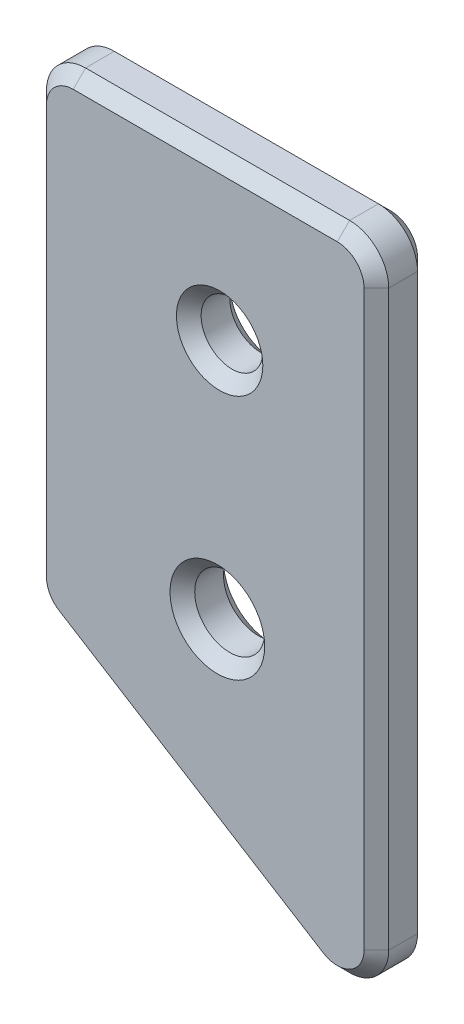
ISO-10303-21;
HEADER;
FILE_DESCRIPTION(('STEP AP214'),'2;1');
FILE_NAME('part.step','',(''),(''),'','','');
FILE_SCHEMA(('AUTOMOTIVE_DESIGN { 1 0 10303 214 1 1 1 1 }'));
ENDSEC;
DATA;
#1=APPLICATION_CONTEXT('core data for automotive mechanical design processes');
#2=APPLICATION_PROTOCOL_DEFINITION('international standard','automotive_design',2000,#1);
#3=PRODUCT_CONTEXT('',#1,'mechanical');
#4=PRODUCT('Part','Part','',(#3));
#5=PRODUCT_RELATED_PRODUCT_CATEGORY('part','',(#4));
#6=PRODUCT_DEFINITION_FORMATION('','',#4);
#7=PRODUCT_DEFINITION_CONTEXT('part definition',#1,'design');
#8=PRODUCT_DEFINITION('design','',#6,#7);
#9=PRODUCT_DEFINITION_SHAPE('','',#8);
#10=(LENGTH_UNIT() NAMED_UNIT(*) SI_UNIT(.MILLI.,.METRE.));
#11=(NAMED_UNIT(*) PLANE_ANGLE_UNIT() SI_UNIT($,.RADIAN.));
#12=(NAMED_UNIT(*) SI_UNIT($,.STERADIAN.) SOLID_ANGLE_UNIT());
#13=UNCERTAINTY_MEASURE_WITH_UNIT(LENGTH_MEASURE(1.E-05),#10,'distance_accuracy_value','');
#14=(GEOMETRIC_REPRESENTATION_CONTEXT(3) GLOBAL_UNCERTAINTY_ASSIGNED_CONTEXT((#13)) GLOBAL_UNIT_ASSIGNED_CONTEXT((#10,
#11,#12)) REPRESENTATION_CONTEXT('',''));
#15=CARTESIAN_POINT('',(0.,0.,0.));
#16=DIRECTION('',(0.,0.,1.));
#17=DIRECTION('',(1.,0.,0.));
#18=AXIS2_PLACEMENT_3D('',#15,#16,#17);
#19=CARTESIAN_POINT('',(-11.7460211072927,-18.8707720601408,6.5));
#20=DIRECTION('',(-0.528438334722349,-0.84897168762914,0.));
#21=DIRECTION('',(0.84897168762914,-0.528438334722349,0.));
#22=AXIS2_PLACEMENT_3D('',#19,#20,#21);
#23=PLANE('',#22);
#24=DIRECTION('',(0.,0.,-1.));
#25=VECTOR('',#24,1.);
#26=CARTESIAN_POINT('',(53.3810741385601,-59.4088185680665,6.5));
#27=LINE('',#26,#25);
#28=CARTESIAN_POINT('',(53.3810741385601,-59.4088185680665,4.99999999999999));
#29=VERTEX_POINT('',#28);
#30=CARTESIAN_POINT('',(53.3810741385601,-59.4088185680665,1.50000000000003));
#31=VERTEX_POINT('',#30);
#32=EDGE_CURVE('E310',#29,#31,#27,.T.);
#33=ORIENTED_EDGE('',*,*,#32,.F.);
#34=DIRECTION('',(-0.84897168762914,0.528438334722349,0.));
#35=VECTOR('',#34,1.);
#36=CARTESIAN_POINT('',(-11.7460211072927,-18.8707720601408,4.99999999999998));
#37=LINE('',#36,#35);
#38=CARTESIAN_POINT('',(21.2899179100688,-39.4338330605326,4.99999999999998));
#39=VERTEX_POINT('',#38);
#40=EDGE_CURVE('E218',#29,#39,#37,.T.);
#41=ORIENTED_EDGE('',*,*,#40,.T.);
#42=DIRECTION('',(0.,0.,-1.));
#43=VECTOR('',#42,1.);
#44=CARTESIAN_POINT('',(21.2899179100688,-39.4338330605326,0.));
#45=LINE('',#44,#43);
#46=CARTESIAN_POINT('',(21.2899179100688,-39.4338330605326,1.50000000000003));
#47=VERTEX_POINT('',#46);
#48=EDGE_CURVE('E306',#39,#47,#45,.T.);
#49=ORIENTED_EDGE('',*,*,#48,.T.);
#50=DIRECTION('',(0.84897168762914,-0.528438334722349,0.));
#51=VECTOR('',#50,1.);
#52=CARTESIAN_POINT('',(53.3810741385601,-59.4088185680665,1.50000000000003));
#53=LINE('',#52,#51);
#54=EDGE_CURVE('E216',#47,#31,#53,.T.);
#55=ORIENTED_EDGE('',*,*,#54,.T.);
#56=EDGE_LOOP('',(#33,#41,#49,#55));
#57=FACE_BOUND('',#56,.T.);
#58=ADVANCED_FACE('F37',(#57),#23,.T.);
#59=CARTESIAN_POINT('',(55.8911562284912,-55.3762030518281,6.5));
#60=DIRECTION('',(0.,0.,-1.));
#61=DIRECTION('',(-1.,0.,0.));
#62=AXIS2_PLACEMENT_3D('',#59,#60,#61);
#63=CYLINDRICAL_SURFACE('',#62,4.74999999999999);
#64=DIRECTION('',(0.,0.,-1.));
#65=VECTOR('',#64,1.);
#66=CARTESIAN_POINT('',(60.6411562284913,-55.3762030518281,6.5));
#67=LINE('',#66,#65);
#68=CARTESIAN_POINT('',(60.6411562284913,-55.3762030518281,4.99999999999999));
#69=VERTEX_POINT('',#68);
#70=CARTESIAN_POINT('',(60.6411562284913,-55.3762030518281,1.50000000000003));
#71=VERTEX_POINT('',#70);
#72=EDGE_CURVE('E344',#69,#71,#67,.T.);
#73=ORIENTED_EDGE('',*,*,#72,.F.);
#74=CARTESIAN_POINT('',(55.8911562284912,-55.3762030518281,4.99999999999998));
#75=DIRECTION('',(0.,0.,1.));
#76=DIRECTION('',(1.,0.,0.));
#77=AXIS2_PLACEMENT_3D('',#74,#75,#76);
#78=CIRCLE('',#77,4.74999999999999);
#79=EDGE_CURVE('E214',#69,#29,#78,.F.);
#80=ORIENTED_EDGE('',*,*,#79,.T.);
#81=ORIENTED_EDGE('',*,*,#32,.T.);
#82=CARTESIAN_POINT('',(55.8911562284912,-55.3762030518281,1.50000000000003));
#83=DIRECTION('',(0.,0.,1.));
#84=DIRECTION('',(1.,0.,0.));
#85=AXIS2_PLACEMENT_3D('',#82,#83,#84);
#86=CIRCLE('',#85,4.74999999999999);
#87=EDGE_CURVE('E211',#31,#71,#86,.T.);
#88=ORIENTED_EDGE('',*,*,#87,.T.);
#89=EDGE_LOOP('',(#73,#80,#81,#88));
#90=FACE_BOUND('',#89,.T.);
#91=ADVANCED_FACE('F353',(#90),#63,.T.);
#92=CARTESIAN_POINT('',(60.6411562284913,0.,6.5));
#93=DIRECTION('',(1.,0.,0.));
#94=DIRECTION('',(0.,0.,-1.));
#95=AXIS2_PLACEMENT_3D('',#92,#93,#94);
#96=PLANE('',#95);
#97=DIRECTION('',(0.,0.,-1.));
#98=VECTOR('',#97,1.);
#99=CARTESIAN_POINT('',(60.6411562284913,14.2999999999999,6.5));
#100=LINE('',#99,#98);
#101=CARTESIAN_POINT('',(60.6411562284913,14.2999999999999,4.99999999999999));
#102=VERTEX_POINT('',#101);
#103=CARTESIAN_POINT('',(60.6411562284913,14.2999999999999,1.50000000000003));
#104=VERTEX_POINT('',#103);
#105=EDGE_CURVE('E341',#102,#104,#100,.T.);
#106=ORIENTED_EDGE('',*,*,#105,.F.);
#107=DIRECTION('',(0.,-1.,0.));
#108=VECTOR('',#107,1.);
#109=CARTESIAN_POINT('',(60.6411562284913,0.,4.99999999999998));
#110=LINE('',#109,#108);
#111=EDGE_CURVE('E209',#102,#69,#110,.T.);
#112=ORIENTED_EDGE('',*,*,#111,.T.);
#113=ORIENTED_EDGE('',*,*,#72,.T.);
#114=DIRECTION('',(0.,1.,0.));
#115=VECTOR('',#114,1.);
#116=CARTESIAN_POINT('',(60.6411562284913,14.2999999999999,1.50000000000003));
#117=LINE('',#116,#115);
#118=EDGE_CURVE('E207',#71,#104,#117,.T.);
#119=ORIENTED_EDGE('',*,*,#118,.T.);
#120=EDGE_LOOP('',(#106,#112,#113,#119));
#121=FACE_BOUND('',#120,.T.);
#122=ADVANCED_FACE('F388',(#121),#96,.T.);
#123=CARTESIAN_POINT('',(55.8911562284913,14.2999999999999,6.5));
#124=DIRECTION('',(0.,0.,-1.));
#125=DIRECTION('',(-1.,0.,0.));
#126=AXIS2_PLACEMENT_3D('',#123,#124,#125);
#127=CYLINDRICAL_SURFACE('',#126,4.75);
#128=DIRECTION('',(0.,0.,-1.));
#129=VECTOR('',#128,1.);
#130=CARTESIAN_POINT('',(55.8911562284913,19.0499999999999,6.5));
#131=LINE('',#130,#129);
#132=CARTESIAN_POINT('',(55.8911562284913,19.0499999999999,4.99999999999999));
#133=VERTEX_POINT('',#132);
#134=CARTESIAN_POINT('',(55.8911562284913,19.0499999999999,1.50000000000003));
#135=VERTEX_POINT('',#134);
#136=EDGE_CURVE('E261',#133,#135,#131,.T.);
#137=ORIENTED_EDGE('',*,*,#136,.F.);
#138=CARTESIAN_POINT('',(55.8911562284913,14.2999999999999,4.99999999999998));
#139=DIRECTION('',(0.,0.,1.));
#140=DIRECTION('',(1.,0.,0.));
#141=AXIS2_PLACEMENT_3D('',#138,#139,#140);
#142=CIRCLE('',#141,4.75);
#143=EDGE_CURVE('E205',#133,#102,#142,.F.);
#144=ORIENTED_EDGE('',*,*,#143,.T.);
#145=ORIENTED_EDGE('',*,*,#105,.T.);
#146=CARTESIAN_POINT('',(55.8911562284913,14.2999999999999,1.50000000000003));
#147=DIRECTION('',(0.,0.,1.));
#148=DIRECTION('',(1.,0.,0.));
#149=AXIS2_PLACEMENT_3D('',#146,#147,#148);
#150=CIRCLE('',#149,4.75);
#151=EDGE_CURVE('E203',#104,#135,#150,.T.);
#152=ORIENTED_EDGE('',*,*,#151,.T.);
#153=EDGE_LOOP('',(#137,#144,#145,#152));
#154=FACE_BOUND('',#153,.T.);
#155=ADVANCED_FACE('F617',(#154),#127,.T.);
#156=CARTESIAN_POINT('',(0.,19.0499999999999,6.5));
#157=DIRECTION('',(0.,-1.,0.));
#158=DIRECTION('',(1.,0.,0.));
#159=AXIS2_PLACEMENT_3D('',#156,#157,#158);
#160=PLANE('',#159);
#161=DIRECTION('',(0.,0.,-1.));
#162=VECTOR('',#161,1.);
#163=CARTESIAN_POINT('',(23.8,19.0499999999999,6.5));
#164=LINE('',#163,#162);
#165=CARTESIAN_POINT('',(23.8,19.0499999999999,1.50000000000003));
#166=VERTEX_POINT('',#165);
#167=CARTESIAN_POINT('',(23.8,19.0499999999999,4.99999999999998));
#168=VERTEX_POINT('',#167);
#169=EDGE_CURVE('E300',#166,#168,#164,.F.);
#170=ORIENTED_EDGE('',*,*,#169,.T.);
#171=DIRECTION('',(1.,0.,0.));
#172=VECTOR('',#171,1.);
#173=CARTESIAN_POINT('',(55.8911562284913,19.0499999999999,4.99999999999998));
#174=LINE('',#173,#172);
#175=EDGE_CURVE('E201',#168,#133,#174,.T.);
#176=ORIENTED_EDGE('',*,*,#175,.T.);
#177=ORIENTED_EDGE('',*,*,#136,.T.);
#178=DIRECTION('',(-1.,0.,0.));
#179=VECTOR('',#178,1.);
#180=CARTESIAN_POINT('',(0.,19.0499999999999,1.50000000000003));
#181=LINE('',#180,#179);
#182=EDGE_CURVE('E199',#135,#166,#181,.T.);
#183=ORIENTED_EDGE('',*,*,#182,.T.);
#184=EDGE_LOOP('',(#170,#176,#177,#183));
#185=FACE_BOUND('',#184,.T.);
#186=ADVANCED_FACE('F339',(#185),#160,.F.);
#187=CARTESIAN_POINT('',(41.5911562284913,-2.84494650060196E-13,6.5));
#188=DIRECTION('',(0.,0.,-1.));
#189=DIRECTION('',(-1.,0.,0.));
#190=AXIS2_PLACEMENT_3D('',#187,#188,#189);
#191=CYLINDRICAL_SURFACE('',#190,3.74999999999999);
#192=CARTESIAN_POINT('',(41.5911562284913,-2.84494650060196E-13,4.99999999999995));
#193=DIRECTION('',(0.,0.,1.));
#194=DIRECTION('',(1.,0.,0.));
#195=AXIS2_PLACEMENT_3D('',#192,#193,#194);
#196=CIRCLE('',#195,3.74999999999999);
#197=CARTESIAN_POINT('',(37.8411562284913,-2.84494650060196E-13,4.99999999999995));
#198=VERTEX_POINT('',#197);
#199=EDGE_CURVE('E193',#198,#198,#196,.T.);
#200=CARTESIAN_POINT('',(41.5911562284913,-2.84494650060196E-13,1.49999999999997));
#201=DIRECTION('',(0.,0.,1.));
#202=DIRECTION('',(1.,0.,0.));
#203=AXIS2_PLACEMENT_3D('',#200,#201,#202);
#204=CIRCLE('',#203,3.74999999999999);
#205=CARTESIAN_POINT('',(37.8411562284913,-2.84494650060196E-13,1.49999999999997));
#206=VERTEX_POINT('',#205);
#207=EDGE_CURVE('E190',#206,#206,#204,.F.);
#208=CARTESIAN_POINT('',(37.8411562284913,-2.84494650060196E-13,4.99999999999995));
#209=CARTESIAN_POINT('',(37.8411562284913,-2.84494650060196E-13,4.96354166666662));
#210=CARTESIAN_POINT('',(37.8411562284913,-2.84494650060196E-13,4.92708333333328));
#211=CARTESIAN_POINT('',(37.8411562284913,-2.84494650060196E-13,4.85416666666662));
#212=CARTESIAN_POINT('',(37.8411562284913,-2.84494650060196E-13,4.81770833333328));
#213=CARTESIAN_POINT('',(37.8411562284913,-2.84494650060196E-13,4.74479166666662));
#214=CARTESIAN_POINT('',(37.8411562284913,-2.84494650060196E-13,4.70833333333328));
#215=CARTESIAN_POINT('',(37.8411562284913,-2.84494650060196E-13,4.63541666666662));
#216=CARTESIAN_POINT('',(37.8411562284913,-2.84494650060196E-13,4.59895833333328));
#217=CARTESIAN_POINT('',(37.8411562284913,-2.84494650060196E-13,4.52604166666662));
#218=CARTESIAN_POINT('',(37.8411562284913,-2.84494650060196E-13,4.48958333333328));
#219=CARTESIAN_POINT('',(37.8411562284913,-2.84494650060196E-13,4.41666666666662));
#220=CARTESIAN_POINT('',(37.8411562284913,-2.84494650060196E-13,4.38020833333328));
#221=CARTESIAN_POINT('',(37.8411562284913,-2.84494650060196E-13,4.30729166666662));
#222=CARTESIAN_POINT('',(37.8411562284913,-2.84494650060196E-13,4.27083333333329));
#223=CARTESIAN_POINT('',(37.8411562284913,-2.84494650060196E-13,4.19791666666662));
#224=CARTESIAN_POINT('',(37.8411562284913,-2.84494650060196E-13,4.16145833333329));
#225=CARTESIAN_POINT('',(37.8411562284913,-2.84494650060196E-13,4.08854166666662));
#226=CARTESIAN_POINT('',(37.8411562284913,-2.84494650060196E-13,4.05208333333329));
#227=CARTESIAN_POINT('',(37.8411562284913,-2.84494650060196E-13,3.97916666666662));
#228=CARTESIAN_POINT('',(37.8411562284913,-2.84494650060196E-13,3.94270833333329));
#229=CARTESIAN_POINT('',(37.8411562284913,-2.84494650060196E-13,3.86979166666662));
#230=CARTESIAN_POINT('',(37.8411562284913,-2.84494650060196E-13,3.83333333333329));
#231=CARTESIAN_POINT('',(37.8411562284913,-2.84494650060196E-13,3.76041666666662));
#232=CARTESIAN_POINT('',(37.8411562284913,-2.84494650060196E-13,3.72395833333329));
#233=CARTESIAN_POINT('',(37.8411562284913,-2.84494650060196E-13,3.65104166666662));
#234=CARTESIAN_POINT('',(37.8411562284913,-2.84494650060196E-13,3.61458333333329));
#235=CARTESIAN_POINT('',(37.8411562284913,-2.84494650060196E-13,3.54166666666662));
#236=CARTESIAN_POINT('',(37.8411562284913,-2.84494650060196E-13,3.50520833333329));
#237=CARTESIAN_POINT('',(37.8411562284913,-2.84494650060196E-13,3.43229166666662));
#238=CARTESIAN_POINT('',(37.8411562284913,-2.84494650060196E-13,3.39583333333329));
#239=CARTESIAN_POINT('',(37.8411562284913,-2.84494650060196E-13,3.32291666666662));
#240=CARTESIAN_POINT('',(37.8411562284913,-2.84494650060196E-13,3.28645833333329));
#241=CARTESIAN_POINT('',(37.8411562284913,-2.84494650060196E-13,3.21354166666663));
#242=CARTESIAN_POINT('',(37.8411562284913,-2.84494650060196E-13,3.17708333333329));
#243=CARTESIAN_POINT('',(37.8411562284913,-2.84494650060196E-13,3.10416666666663));
#244=CARTESIAN_POINT('',(37.8411562284913,-2.84494650060196E-13,3.06770833333329));
#245=CARTESIAN_POINT('',(37.8411562284913,-2.84494650060196E-13,2.99479166666663));
#246=CARTESIAN_POINT('',(37.8411562284913,-2.84494650060196E-13,2.95833333333329));
#247=CARTESIAN_POINT('',(37.8411562284913,-2.84494650060196E-13,2.88541666666663));
#248=CARTESIAN_POINT('',(37.8411562284913,-2.84494650060196E-13,2.84895833333329));
#249=CARTESIAN_POINT('',(37.8411562284913,-2.84494650060196E-13,2.77604166666663));
#250=CARTESIAN_POINT('',(37.8411562284913,-2.84494650060196E-13,2.73958333333329));
#251=CARTESIAN_POINT('',(37.8411562284913,-2.84494650060196E-13,2.66666666666663));
#252=CARTESIAN_POINT('',(37.8411562284913,-2.84494650060196E-13,2.6302083333333));
#253=CARTESIAN_POINT('',(37.8411562284913,-2.84494650060196E-13,2.55729166666663));
#254=CARTESIAN_POINT('',(37.8411562284913,-2.84494650060196E-13,2.5208333333333));
#255=CARTESIAN_POINT('',(37.8411562284913,-2.84494650060196E-13,2.44791666666663));
#256=CARTESIAN_POINT('',(37.8411562284913,-2.84494650060196E-13,2.4114583333333));
#257=CARTESIAN_POINT('',(37.8411562284913,-2.84494650060196E-13,2.33854166666663));
#258=CARTESIAN_POINT('',(37.8411562284913,-2.84494650060196E-13,2.3020833333333));
#259=CARTESIAN_POINT('',(37.8411562284913,-2.84494650060196E-13,2.22916666666663));
#260=CARTESIAN_POINT('',(37.8411562284913,-2.84494650060196E-13,2.1927083333333));
#261=CARTESIAN_POINT('',(37.8411562284913,-2.84494650060196E-13,2.11979166666663));
#262=CARTESIAN_POINT('',(37.8411562284913,-2.84494650060196E-13,2.0833333333333));
#263=CARTESIAN_POINT('',(37.8411562284913,-2.84494650060196E-13,2.01041666666663));
#264=CARTESIAN_POINT('',(37.8411562284913,-2.84494650060196E-13,1.9739583333333));
#265=CARTESIAN_POINT('',(37.8411562284913,-2.84494650060196E-13,1.90104166666663));
#266=CARTESIAN_POINT('',(37.8411562284913,-2.84494650060196E-13,1.8645833333333));
#267=CARTESIAN_POINT('',(37.8411562284913,-2.84494650060196E-13,1.79166666666663));
#268=CARTESIAN_POINT('',(37.8411562284913,-2.84494650060196E-13,1.7552083333333));
#269=CARTESIAN_POINT('',(37.8411562284913,-2.84494650060196E-13,1.68229166666663));
#270=CARTESIAN_POINT('',(37.8411562284913,-2.84494650060196E-13,1.6458333333333));
#271=CARTESIAN_POINT('',(37.8411562284913,-2.84494650060196E-13,1.57291666666663));
#272=CARTESIAN_POINT('',(37.8411562284913,-2.84494650060196E-13,1.5364583333333));
#273=CARTESIAN_POINT('',(37.8411562284913,-2.84494650060196E-13,1.49999999999997));
#274=B_SPLINE_CURVE_WITH_KNOTS('',3,(#208,#209,#210,#211,#212,#213,#214,#215,#216,#217,#218,
#219,#220,#221,#222,#223,#224,#225,#226,#227,#228,#229,#230,#231,#232,#233,#234,#235,#236,#237,
#238,#239,#240,#241,#242,#243,#244,#245,#246,#247,#248,#249,#250,#251,#252,#253,#254,#255,#256,
#257,#258,#259,#260,#261,#262,#263,#264,#265,#266,#267,#268,#269,#270,#271,#272,#273),
.UNSPECIFIED.,.F.,.F.,(4,2,2,2,2,2,2,2,2,2,2,2,2,2,2,2,2,2,2,2,2,2,2,2,2,2,2,2,2,2,2,2,4),(0.,
0.109374999999999,0.218749999999999,0.328124999999999,0.437499999999998,0.546874999999997,
0.656249999999996,0.765624999999996,0.874999999999995,0.984374999999995,1.09374999999999,
1.20312499999999,1.31249999999999,1.42187499999999,1.53124999999999,1.64062499999999,
1.74999999999999,1.85937499999999,1.96874999999999,2.07812499999999,2.18749999999999,
2.29687499999999,2.40624999999999,2.51562499999999,2.62499999999998,2.73437499999998,
2.84374999999998,2.95312499999998,3.06249999999998,3.17187499999998,3.28124999999998,
3.39062499999998,3.49999999999998),.UNSPECIFIED.);
#275=EDGE_CURVE('BSEAM599',#198,#206,#274,.T.);
#276=ORIENTED_EDGE('',*,*,#199,.T.);
#277=ORIENTED_EDGE('',*,*,#207,.T.);
#278=ORIENTED_EDGE('',*,*,#275,.T.);
#279=ORIENTED_EDGE('',*,*,#275,.F.);
#280=EDGE_LOOP('',(#276,#278,#277,#279));
#281=FACE_BOUND('',#280,.T.);
#282=ADVANCED_FACE('F599',(#281),#191,.F.);
#283=CARTESIAN_POINT('',(41.3149906063359,-29.459432199959,6.5));
#284=DIRECTION('',(0.,0.,-1.));
#285=DIRECTION('',(-1.,0.,0.));
#286=AXIS2_PLACEMENT_3D('',#283,#284,#285);
#287=CYLINDRICAL_SURFACE('',#286,4.25);
#288=CARTESIAN_POINT('',(41.3149906063359,-29.459432199959,4.99999999999995));
#289=DIRECTION('',(0.,0.,1.));
#290=DIRECTION('',(1.,0.,0.));
#291=AXIS2_PLACEMENT_3D('',#288,#289,#290);
#292=CIRCLE('',#291,4.25);
#293=CARTESIAN_POINT('',(37.0649906063359,-29.459432199959,4.99999999999995));
#294=VERTEX_POINT('',#293);
#295=EDGE_CURVE('E173',#294,#294,#292,.T.);
#296=CARTESIAN_POINT('',(41.3149906063359,-29.459432199959,1.49999999999997));
#297=DIRECTION('',(0.,0.,1.));
#298=DIRECTION('',(1.,0.,0.));
#299=AXIS2_PLACEMENT_3D('',#296,#297,#298);
#300=CIRCLE('',#299,4.25);
#301=CARTESIAN_POINT('',(37.0649906063359,-29.459432199959,1.49999999999997));
#302=VERTEX_POINT('',#301);
#303=EDGE_CURVE('E315',#302,#302,#300,.F.);
#304=CARTESIAN_POINT('',(37.0649906063359,-29.459432199959,4.99999999999995));
#305=CARTESIAN_POINT('',(37.0649906063359,-29.459432199959,4.96354166666662));
#306=CARTESIAN_POINT('',(37.0649906063359,-29.459432199959,4.92708333333329));
#307=CARTESIAN_POINT('',(37.0649906063359,-29.459432199959,4.85416666666662));
#308=CARTESIAN_POINT('',(37.0649906063359,-29.459432199959,4.81770833333329));
#309=CARTESIAN_POINT('',(37.0649906063359,-29.459432199959,4.74479166666662));
#310=CARTESIAN_POINT('',(37.0649906063359,-29.459432199959,4.70833333333329));
#311=CARTESIAN_POINT('',(37.0649906063359,-29.459432199959,4.63541666666662));
#312=CARTESIAN_POINT('',(37.0649906063359,-29.459432199959,4.59895833333329));
#313=CARTESIAN_POINT('',(37.0649906063359,-29.459432199959,4.52604166666662));
#314=CARTESIAN_POINT('',(37.0649906063359,-29.459432199959,4.48958333333329));
#315=CARTESIAN_POINT('',(37.0649906063359,-29.459432199959,4.41666666666662));
#316=CARTESIAN_POINT('',(37.0649906063359,-29.459432199959,4.38020833333329));
#317=CARTESIAN_POINT('',(37.0649906063359,-29.459432199959,4.30729166666662));
#318=CARTESIAN_POINT('',(37.0649906063359,-29.459432199959,4.27083333333329));
#319=CARTESIAN_POINT('',(37.0649906063359,-29.459432199959,4.19791666666662));
#320=CARTESIAN_POINT('',(37.0649906063359,-29.459432199959,4.16145833333329));
#321=CARTESIAN_POINT('',(37.0649906063359,-29.459432199959,4.08854166666662));
#322=CARTESIAN_POINT('',(37.0649906063359,-29.459432199959,4.05208333333329));
#323=CARTESIAN_POINT('',(37.0649906063359,-29.459432199959,3.97916666666662));
#324=CARTESIAN_POINT('',(37.0649906063359,-29.459432199959,3.94270833333329));
#325=CARTESIAN_POINT('',(37.0649906063359,-29.459432199959,3.86979166666662));
#326=CARTESIAN_POINT('',(37.0649906063359,-29.459432199959,3.83333333333329));
#327=CARTESIAN_POINT('',(37.0649906063359,-29.459432199959,3.76041666666662));
#328=CARTESIAN_POINT('',(37.0649906063359,-29.459432199959,3.72395833333329));
#329=CARTESIAN_POINT('',(37.0649906063359,-29.459432199959,3.65104166666662));
#330=CARTESIAN_POINT('',(37.0649906063359,-29.459432199959,3.61458333333329));
#331=CARTESIAN_POINT('',(37.0649906063359,-29.459432199959,3.54166666666663));
#332=CARTESIAN_POINT('',(37.0649906063359,-29.459432199959,3.50520833333329));
#333=CARTESIAN_POINT('',(37.0649906063359,-29.459432199959,3.43229166666663));
#334=CARTESIAN_POINT('',(37.0649906063359,-29.459432199959,3.39583333333329));
#335=CARTESIAN_POINT('',(37.0649906063359,-29.459432199959,3.32291666666663));
#336=CARTESIAN_POINT('',(37.0649906063359,-29.459432199959,3.28645833333329));
#337=CARTESIAN_POINT('',(37.0649906063359,-29.459432199959,3.21354166666663));
#338=CARTESIAN_POINT('',(37.0649906063359,-29.459432199959,3.17708333333329));
#339=CARTESIAN_POINT('',(37.0649906063359,-29.459432199959,3.10416666666663));
#340=CARTESIAN_POINT('',(37.0649906063359,-29.459432199959,3.06770833333329));
#341=CARTESIAN_POINT('',(37.0649906063359,-29.459432199959,2.99479166666663));
#342=CARTESIAN_POINT('',(37.0649906063359,-29.459432199959,2.95833333333329));
#343=CARTESIAN_POINT('',(37.0649906063359,-29.459432199959,2.88541666666663));
#344=CARTESIAN_POINT('',(37.0649906063359,-29.459432199959,2.84895833333329));
#345=CARTESIAN_POINT('',(37.0649906063359,-29.459432199959,2.77604166666663));
#346=CARTESIAN_POINT('',(37.0649906063359,-29.459432199959,2.7395833333333));
#347=CARTESIAN_POINT('',(37.0649906063359,-29.459432199959,2.66666666666663));
#348=CARTESIAN_POINT('',(37.0649906063359,-29.459432199959,2.6302083333333));
#349=CARTESIAN_POINT('',(37.0649906063359,-29.459432199959,2.55729166666663));
#350=CARTESIAN_POINT('',(37.0649906063359,-29.459432199959,2.5208333333333));
#351=CARTESIAN_POINT('',(37.0649906063359,-29.459432199959,2.44791666666663));
#352=CARTESIAN_POINT('',(37.0649906063359,-29.459432199959,2.4114583333333));
#353=CARTESIAN_POINT('',(37.0649906063359,-29.459432199959,2.33854166666663));
#354=CARTESIAN_POINT('',(37.0649906063359,-29.459432199959,2.3020833333333));
#355=CARTESIAN_POINT('',(37.0649906063359,-29.459432199959,2.22916666666663));
#356=CARTESIAN_POINT('',(37.0649906063359,-29.459432199959,2.1927083333333));
#357=CARTESIAN_POINT('',(37.0649906063359,-29.459432199959,2.11979166666663));
#358=CARTESIAN_POINT('',(37.0649906063359,-29.459432199959,2.0833333333333));
#359=CARTESIAN_POINT('',(37.0649906063359,-29.459432199959,2.01041666666663));
#360=CARTESIAN_POINT('',(37.0649906063359,-29.459432199959,1.9739583333333));
#361=CARTESIAN_POINT('',(37.0649906063359,-29.459432199959,1.90104166666663));
#362=CARTESIAN_POINT('',(37.0649906063359,-29.459432199959,1.8645833333333));
#363=CARTESIAN_POINT('',(37.0649906063359,-29.459432199959,1.79166666666663));
#364=CARTESIAN_POINT('',(37.0649906063359,-29.459432199959,1.7552083333333));
#365=CARTESIAN_POINT('',(37.0649906063359,-29.459432199959,1.68229166666663));
#366=CARTESIAN_POINT('',(37.0649906063359,-29.459432199959,1.6458333333333));
#367=CARTESIAN_POINT('',(37.0649906063359,-29.459432199959,1.57291666666663));
#368=CARTESIAN_POINT('',(37.0649906063359,-29.459432199959,1.5364583333333));
#369=CARTESIAN_POINT('',(37.0649906063359,-29.459432199959,1.49999999999997));
#370=B_SPLINE_CURVE_WITH_KNOTS('',3,(#304,#305,#306,#307,#308,#309,#310,#311,#312,#313,#314,
#315,#316,#317,#318,#319,#320,#321,#322,#323,#324,#325,#326,#327,#328,#329,#330,#331,#332,#333,
#334,#335,#336,#337,#338,#339,#340,#341,#342,#343,#344,#345,#346,#347,#348,#349,#350,#351,#352,
#353,#354,#355,#356,#357,#358,#359,#360,#361,#362,#363,#364,#365,#366,#367,#368,#369),
.UNSPECIFIED.,.F.,.F.,(4,2,2,2,2,2,2,2,2,2,2,2,2,2,2,2,2,2,2,2,2,2,2,2,2,2,2,2,2,2,2,2,4),(0.,
0.109374999999999,0.218749999999999,0.328124999999999,0.437499999999998,0.546874999999998,
0.656249999999996,0.765624999999996,0.874999999999996,0.984374999999995,1.09374999999999,
1.20312499999999,1.31249999999999,1.42187499999999,1.53124999999999,1.64062499999999,
1.74999999999999,1.85937499999999,1.96874999999999,2.07812499999999,2.18749999999999,
2.29687499999999,2.40624999999999,2.51562499999999,2.62499999999999,2.73437499999999,
2.84374999999999,2.95312499999999,3.06249999999999,3.17187499999998,3.28124999999998,
3.39062499999998,3.49999999999998),.UNSPECIFIED.);
#371=EDGE_CURVE('BSEAM378',#294,#302,#370,.T.);
#372=ORIENTED_EDGE('',*,*,#295,.T.);
#373=ORIENTED_EDGE('',*,*,#303,.T.);
#374=ORIENTED_EDGE('',*,*,#371,.T.);
#375=ORIENTED_EDGE('',*,*,#371,.F.);
#376=EDGE_LOOP('',(#372,#374,#373,#375));
#377=FACE_BOUND('',#376,.T.);
#378=ADVANCED_FACE('F378',(#377),#287,.F.);
#379=CARTESIAN_POINT('',(0.,0.,6.5));
#380=DIRECTION('',(0.,0.,1.));
#381=DIRECTION('',(1.,0.,0.));
#382=AXIS2_PLACEMENT_3D('',#379,#380,#381);
#383=PLANE('',#382);
#384=CARTESIAN_POINT('',(41.3149906063359,-29.459432199959,6.5));
#385=DIRECTION('',(0.,0.,1.));
#386=DIRECTION('',(1.,0.,0.));
#387=AXIS2_PLACEMENT_3D('',#384,#385,#386);
#388=CIRCLE('',#387,5.75000000000005);
#389=CARTESIAN_POINT('',(47.0649906063359,-29.459432199959,6.5));
#390=VERTEX_POINT('',#389);
#391=EDGE_CURVE('E182',#390,#390,#388,.F.);
#392=ORIENTED_EDGE('',*,*,#391,.T.);
#393=EDGE_LOOP('',(#392));
#394=FACE_BOUND('',#393,.T.);
#395=CARTESIAN_POINT('',(41.5911562284913,-2.84494650060196E-13,6.5));
#396=DIRECTION('',(0.,0.,1.));
#397=DIRECTION('',(1.,0.,0.));
#398=AXIS2_PLACEMENT_3D('',#395,#396,#397);
#399=CIRCLE('',#398,5.25000000000005);
#400=CARTESIAN_POINT('',(46.8411562284913,-2.84494650060196E-13,6.5));
#401=VERTEX_POINT('',#400);
#402=EDGE_CURVE('E179',#401,#401,#399,.F.);
#403=ORIENTED_EDGE('',*,*,#402,.T.);
#404=EDGE_LOOP('',(#403));
#405=FACE_BOUND('',#404,.T.);
#406=DIRECTION('',(-1.,0.,0.));
#407=VECTOR('',#406,1.);
#408=CARTESIAN_POINT('',(23.8,17.5499999999999,6.5));
#409=LINE('',#408,#407);
#410=CARTESIAN_POINT('',(55.8911562284913,17.5499999999999,6.5));
#411=VERTEX_POINT('',#410);
#412=CARTESIAN_POINT('',(23.8,17.5499999999999,6.5));
#413=VERTEX_POINT('',#412);
#414=EDGE_CURVE('E177',#411,#413,#409,.T.);
#415=ORIENTED_EDGE('',*,*,#414,.T.);
#416=CARTESIAN_POINT('',(23.8,14.2999999999999,6.5));
#417=DIRECTION('',(0.,0.,1.));
#418=DIRECTION('',(1.,0.,0.));
#419=AXIS2_PLACEMENT_3D('',#416,#417,#418);
#420=CIRCLE('',#419,3.24999999999999);
#421=CARTESIAN_POINT('',(20.55,14.2999999999999,6.5));
#422=VERTEX_POINT('',#421);
#423=EDGE_CURVE('E158',#413,#422,#420,.T.);
#424=ORIENTED_EDGE('',*,*,#423,.T.);
#425=DIRECTION('',(0.,-1.,0.));
#426=VECTOR('',#425,1.);
#427=CARTESIAN_POINT('',(20.55,-35.4012175442942,6.5));
#428=LINE('',#427,#426);
#429=CARTESIAN_POINT('',(20.55,-35.4012175442942,6.5));
#430=VERTEX_POINT('',#429);
#431=EDGE_CURVE('E166',#422,#430,#428,.T.);
#432=ORIENTED_EDGE('',*,*,#431,.T.);
#433=CARTESIAN_POINT('',(23.8,-35.4012175442942,6.5));
#434=DIRECTION('',(0.,0.,1.));
#435=DIRECTION('',(1.,0.,0.));
#436=AXIS2_PLACEMENT_3D('',#433,#434,#435);
#437=CIRCLE('',#436,3.24999999999998);
#438=CARTESIAN_POINT('',(22.0825754121524,-38.1603755290889,6.5));
#439=VERTEX_POINT('',#438);
#440=EDGE_CURVE('E172',#430,#439,#437,.T.);
#441=ORIENTED_EDGE('',*,*,#440,.T.);
#442=DIRECTION('',(0.84897168762914,-0.528438334722349,0.));
#443=VECTOR('',#442,1.);
#444=CARTESIAN_POINT('',(-10.9533636052092,-17.597314528697,6.5));
#445=LINE('',#444,#443);
#446=CARTESIAN_POINT('',(54.1737316406437,-58.1353610366228,6.5));
#447=VERTEX_POINT('',#446);
#448=EDGE_CURVE('E321',#439,#447,#445,.T.);
#449=ORIENTED_EDGE('',*,*,#448,.T.);
#450=CARTESIAN_POINT('',(55.8911562284912,-55.3762030518281,6.5));
#451=DIRECTION('',(0.,0.,1.));
#452=DIRECTION('',(1.,0.,0.));
#453=AXIS2_PLACEMENT_3D('',#450,#451,#452);
#454=CIRCLE('',#453,3.24999999999997);
#455=CARTESIAN_POINT('',(59.1411562284912,-55.3762030518281,6.5));
#456=VERTEX_POINT('',#455);
#457=EDGE_CURVE('E323',#447,#456,#454,.T.);
#458=ORIENTED_EDGE('',*,*,#457,.T.);
#459=DIRECTION('',(0.,1.,0.));
#460=VECTOR('',#459,1.);
#461=CARTESIAN_POINT('',(59.1411562284913,0.,6.5));
#462=LINE('',#461,#460);
#463=CARTESIAN_POINT('',(59.1411562284913,14.2999999999999,6.5));
#464=VERTEX_POINT('',#463);
#465=EDGE_CURVE('E325',#456,#464,#462,.T.);
#466=ORIENTED_EDGE('',*,*,#465,.T.);
#467=CARTESIAN_POINT('',(55.8911562284913,14.2999999999999,6.5));
#468=DIRECTION('',(0.,0.,1.));
#469=DIRECTION('',(1.,0.,0.));
#470=AXIS2_PLACEMENT_3D('',#467,#468,#469);
#471=CIRCLE('',#470,3.24999999999999);
#472=EDGE_CURVE('E184',#464,#411,#471,.T.);
#473=ORIENTED_EDGE('',*,*,#472,.T.);
#474=EDGE_LOOP('',(#415,#424,#432,#441,#449,#458,#466,#473));
#475=FACE_BOUND('',#474,.T.);
#476=ADVANCED_FACE('F175',(#394,#405,#475),#383,.T.);
#477=CARTESIAN_POINT('',(0.,0.,0.));
#478=DIRECTION('',(0.,0.,1.));
#479=DIRECTION('',(1.,0.,0.));
#480=AXIS2_PLACEMENT_3D('',#477,#478,#479);
#481=PLANE('',#480);
#482=CARTESIAN_POINT('',(41.3149906063359,-29.459432199959,0.));
#483=DIRECTION('',(0.,0.,1.));
#484=DIRECTION('',(1.,0.,0.));
#485=AXIS2_PLACEMENT_3D('',#482,#483,#484);
#486=CIRCLE('',#485,5.74999999999996);
#487=CARTESIAN_POINT('',(47.0649906063358,-29.459432199959,0.));
#488=VERTEX_POINT('',#487);
#489=EDGE_CURVE('E11',#488,#488,#486,.T.);
#490=ORIENTED_EDGE('',*,*,#489,.T.);
#491=EDGE_LOOP('',(#490));
#492=FACE_BOUND('',#491,.T.);
#493=CARTESIAN_POINT('',(41.5911562284913,-2.84494650060196E-13,0.));
#494=DIRECTION('',(0.,0.,1.));
#495=DIRECTION('',(1.,0.,0.));
#496=AXIS2_PLACEMENT_3D('',#493,#494,#495);
#497=CIRCLE('',#496,5.24999999999996);
#498=CARTESIAN_POINT('',(46.8411562284913,-2.84494650060196E-13,0.));
#499=VERTEX_POINT('',#498);
#500=EDGE_CURVE('E47',#499,#499,#497,.T.);
#501=ORIENTED_EDGE('',*,*,#500,.T.);
#502=EDGE_LOOP('',(#501));
#503=FACE_BOUND('',#502,.T.);
#504=DIRECTION('',(0.,-1.,0.));
#505=VECTOR('',#504,1.);
#506=CARTESIAN_POINT('',(59.1411562284913,-55.3762030518281,0.));
#507=LINE('',#506,#505);
#508=CARTESIAN_POINT('',(59.1411562284913,14.2999999999999,0.));
#509=VERTEX_POINT('',#508);
#510=CARTESIAN_POINT('',(59.1411562284913,-55.3762030518281,0.));
#511=VERTEX_POINT('',#510);
#512=EDGE_CURVE('E55',#509,#511,#507,.T.);
#513=ORIENTED_EDGE('',*,*,#512,.T.);
#514=CARTESIAN_POINT('',(55.8911562284912,-55.3762030518281,0.));
#515=DIRECTION('',(0.,0.,1.));
#516=DIRECTION('',(1.,0.,0.));
#517=AXIS2_PLACEMENT_3D('',#514,#515,#516);
#518=CIRCLE('',#517,3.24999999999997);
#519=CARTESIAN_POINT('',(54.1737316406437,-58.1353610366228,0.));
#520=VERTEX_POINT('',#519);
#521=EDGE_CURVE('E240',#511,#520,#518,.F.);
#522=ORIENTED_EDGE('',*,*,#521,.T.);
#523=DIRECTION('',(-0.84897168762914,0.528438334722349,0.));
#524=VECTOR('',#523,1.);
#525=CARTESIAN_POINT('',(22.0825754121524,-38.1603755290889,0.));
#526=LINE('',#525,#524);
#527=CARTESIAN_POINT('',(22.0825754121524,-38.1603755290889,0.));
#528=VERTEX_POINT('',#527);
#529=EDGE_CURVE('E228',#520,#528,#526,.T.);
#530=ORIENTED_EDGE('',*,*,#529,.T.);
#531=CARTESIAN_POINT('',(23.8,-35.4012175442942,0.));
#532=DIRECTION('',(0.,0.,1.));
#533=DIRECTION('',(1.,0.,0.));
#534=AXIS2_PLACEMENT_3D('',#531,#532,#533);
#535=CIRCLE('',#534,3.24999999999998);
#536=CARTESIAN_POINT('',(20.55,-35.4012175442942,0.));
#537=VERTEX_POINT('',#536);
#538=EDGE_CURVE('E230',#528,#537,#535,.F.);
#539=ORIENTED_EDGE('',*,*,#538,.T.);
#540=DIRECTION('',(0.,1.,0.));
#541=VECTOR('',#540,1.);
#542=CARTESIAN_POINT('',(20.55,0.,0.));
#543=LINE('',#542,#541);
#544=CARTESIAN_POINT('',(20.55,14.2999999999999,0.));
#545=VERTEX_POINT('',#544);
#546=EDGE_CURVE('E232',#537,#545,#543,.T.);
#547=ORIENTED_EDGE('',*,*,#546,.T.);
#548=CARTESIAN_POINT('',(23.8,14.2999999999999,0.));
#549=DIRECTION('',(0.,0.,1.));
#550=DIRECTION('',(1.,0.,0.));
#551=AXIS2_PLACEMENT_3D('',#548,#549,#550);
#552=CIRCLE('',#551,3.24999999999998);
#553=CARTESIAN_POINT('',(23.8,17.5499999999999,0.));
#554=VERTEX_POINT('',#553);
#555=EDGE_CURVE('E234',#545,#554,#552,.F.);
#556=ORIENTED_EDGE('',*,*,#555,.T.);
#557=DIRECTION('',(1.,0.,0.));
#558=VECTOR('',#557,1.);
#559=CARTESIAN_POINT('',(0.,17.5499999999999,0.));
#560=LINE('',#559,#558);
#561=CARTESIAN_POINT('',(55.8911562284913,17.5499999999999,0.));
#562=VERTEX_POINT('',#561);
#563=EDGE_CURVE('E236',#554,#562,#560,.T.);
#564=ORIENTED_EDGE('',*,*,#563,.T.);
#565=CARTESIAN_POINT('',(55.8911562284913,14.2999999999999,0.));
#566=DIRECTION('',(0.,0.,1.));
#567=DIRECTION('',(1.,0.,0.));
#568=AXIS2_PLACEMENT_3D('',#565,#566,#567);
#569=CIRCLE('',#568,3.24999999999998);
#570=EDGE_CURVE('E60',#562,#509,#569,.F.);
#571=ORIENTED_EDGE('',*,*,#570,.T.);
#572=EDGE_LOOP('',(#513,#522,#530,#539,#547,#556,#564,#571));
#573=FACE_BOUND('',#572,.T.);
#574=ADVANCED_FACE('F368',(#492,#503,#573),#481,.F.);
#575=CARTESIAN_POINT('',(19.05,8.99630523520417,10.));
#576=DIRECTION('',(1.,0.,0.));
#577=DIRECTION('',(0.,1.,0.));
#578=AXIS2_PLACEMENT_3D('',#575,#576,#577);
#579=PLANE('',#578);
#580=DIRECTION('',(0.,0.,-1.));
#581=VECTOR('',#580,1.);
#582=CARTESIAN_POINT('',(19.05,-35.4012175442942,6.5));
#583=LINE('',#582,#581);
#584=CARTESIAN_POINT('',(19.05,-35.4012175442942,1.50000000000003));
#585=VERTEX_POINT('',#584);
#586=CARTESIAN_POINT('',(19.05,-35.4012175442942,4.99999999999998));
#587=VERTEX_POINT('',#586);
#588=EDGE_CURVE('E305',#585,#587,#583,.F.);
#589=ORIENTED_EDGE('',*,*,#588,.T.);
#590=DIRECTION('',(0.,1.,0.));
#591=VECTOR('',#590,1.);
#592=CARTESIAN_POINT('',(19.05,14.2999999999999,4.99999999999998));
#593=LINE('',#592,#591);
#594=CARTESIAN_POINT('',(19.05,14.2999999999999,4.99999999999998));
#595=VERTEX_POINT('',#594);
#596=EDGE_CURVE('E226',#587,#595,#593,.T.);
#597=ORIENTED_EDGE('',*,*,#596,.T.);
#598=DIRECTION('',(0.,0.,-1.));
#599=VECTOR('',#598,1.);
#600=CARTESIAN_POINT('',(19.05,14.2999999999999,10.));
#601=LINE('',#600,#599);
#602=CARTESIAN_POINT('',(19.05,14.2999999999999,1.50000000000003));
#603=VERTEX_POINT('',#602);
#604=EDGE_CURVE('E298',#595,#603,#601,.T.);
#605=ORIENTED_EDGE('',*,*,#604,.T.);
#606=DIRECTION('',(0.,-1.,0.));
#607=VECTOR('',#606,1.);
#608=CARTESIAN_POINT('',(19.05,8.99630523520417,1.50000000000003));
#609=LINE('',#608,#607);
#610=EDGE_CURVE('E224',#603,#585,#609,.T.);
#611=ORIENTED_EDGE('',*,*,#610,.T.);
#612=EDGE_LOOP('',(#589,#597,#605,#611));
#613=FACE_BOUND('',#612,.T.);
#614=ADVANCED_FACE('F303',(#613),#579,.F.);
#615=CARTESIAN_POINT('',(23.8,-35.4012175442942,6.5));
#616=DIRECTION('',(0.,0.,1.));
#617=DIRECTION('',(1.,0.,0.));
#618=AXIS2_PLACEMENT_3D('',#615,#616,#617);
#619=CYLINDRICAL_SURFACE('',#618,4.75);
#620=ORIENTED_EDGE('',*,*,#48,.F.);
#621=CARTESIAN_POINT('',(23.8,-35.4012175442942,4.99999999999998));
#622=DIRECTION('',(0.,0.,1.));
#623=DIRECTION('',(1.,0.,0.));
#624=AXIS2_PLACEMENT_3D('',#621,#622,#623);
#625=CIRCLE('',#624,4.75);
#626=EDGE_CURVE('E222',#39,#587,#625,.F.);
#627=ORIENTED_EDGE('',*,*,#626,.T.);
#628=ORIENTED_EDGE('',*,*,#588,.F.);
#629=CARTESIAN_POINT('',(23.8,-35.4012175442942,1.50000000000003));
#630=DIRECTION('',(0.,0.,1.));
#631=DIRECTION('',(1.,0.,0.));
#632=AXIS2_PLACEMENT_3D('',#629,#630,#631);
#633=CIRCLE('',#632,4.75);
#634=EDGE_CURVE('E220',#585,#47,#633,.T.);
#635=ORIENTED_EDGE('',*,*,#634,.T.);
#636=EDGE_LOOP('',(#620,#627,#628,#635));
#637=FACE_BOUND('',#636,.T.);
#638=ADVANCED_FACE('F376',(#637),#619,.T.);
#639=CARTESIAN_POINT('',(23.8,14.2999999999999,10.));
#640=DIRECTION('',(0.,0.,-1.));
#641=DIRECTION('',(-1.,0.,0.));
#642=AXIS2_PLACEMENT_3D('',#639,#640,#641);
#643=CYLINDRICAL_SURFACE('',#642,4.75);
#644=ORIENTED_EDGE('',*,*,#604,.F.);
#645=CARTESIAN_POINT('',(23.8,14.2999999999999,4.99999999999998));
#646=DIRECTION('',(0.,0.,1.));
#647=DIRECTION('',(1.,0.,0.));
#648=AXIS2_PLACEMENT_3D('',#645,#646,#647);
#649=CIRCLE('',#648,4.75);
#650=EDGE_CURVE('E160',#595,#168,#649,.F.);
#651=ORIENTED_EDGE('',*,*,#650,.T.);
#652=ORIENTED_EDGE('',*,*,#169,.F.);
#653=CARTESIAN_POINT('',(23.8,14.2999999999999,1.50000000000003));
#654=DIRECTION('',(0.,0.,1.));
#655=DIRECTION('',(1.,0.,0.));
#656=AXIS2_PLACEMENT_3D('',#653,#654,#655);
#657=CIRCLE('',#656,4.75);
#658=EDGE_CURVE('E196',#166,#603,#657,.T.);
#659=ORIENTED_EDGE('',*,*,#658,.T.);
#660=EDGE_LOOP('',(#644,#651,#652,#659));
#661=FACE_BOUND('',#660,.T.);
#662=ADVANCED_FACE('F297',(#661),#643,.T.);
#663=CARTESIAN_POINT('',(41.3149906063359,-29.459432199959,4.99999999999995));
#664=DIRECTION('',(0.,0.,1.));
#665=DIRECTION('',(1.,0.,0.));
#666=AXIS2_PLACEMENT_3D('',#663,#664,#665);
#667=CONICAL_SURFACE('',#666,4.25,0.785398163397448);
#668=ORIENTED_EDGE('',*,*,#391,.F.);
#669=EDGE_LOOP('',(#668));
#670=FACE_BOUND('',#669,.T.);
#671=ORIENTED_EDGE('',*,*,#295,.F.);
#672=EDGE_LOOP('',(#671));
#673=FACE_BOUND('',#672,.T.);
#674=ADVANCED_FACE('F397',(#670,#673),#667,.F.);
#675=CARTESIAN_POINT('',(41.5911562284913,-2.84494650060196E-13,4.99999999999995));
#676=DIRECTION('',(0.,0.,1.));
#677=DIRECTION('',(1.,0.,0.));
#678=AXIS2_PLACEMENT_3D('',#675,#676,#677);
#679=CONICAL_SURFACE('',#678,3.74999999999999,0.785398163397449);
#680=ORIENTED_EDGE('',*,*,#402,.F.);
#681=EDGE_LOOP('',(#680));
#682=FACE_BOUND('',#681,.T.);
#683=ORIENTED_EDGE('',*,*,#199,.F.);
#684=EDGE_LOOP('',(#683));
#685=FACE_BOUND('',#684,.T.);
#686=ADVANCED_FACE('F404',(#682,#685),#679,.F.);
#687=CARTESIAN_POINT('',(55.8911562284912,-55.3762030518281,4.99999999999998));
#688=DIRECTION('',(0.,0.,-1.));
#689=DIRECTION('',(-1.,0.,0.));
#690=AXIS2_PLACEMENT_3D('',#687,#688,#689);
#691=CONICAL_SURFACE('',#690,4.74999999999999,0.785398163397449);
#692=DIRECTION('',(0.373662329921101,0.600313637357953,0.707106781186546));
#693=VECTOR('',#692,1.);
#694=CARTESIAN_POINT('',(53.3810741385601,-59.4088185680666,4.99999999999998));
#695=LINE('',#694,#693);
#696=EDGE_CURVE('E255',#29,#447,#695,.T.);
#697=ORIENTED_EDGE('',*,*,#696,.F.);
#698=ORIENTED_EDGE('',*,*,#79,.F.);
#699=DIRECTION('',(0.707106781186547,0.,-0.707106781186547));
#700=VECTOR('',#699,1.);
#701=CARTESIAN_POINT('',(59.1411562284912,-55.3762030518281,6.5));
#702=LINE('',#701,#700);
#703=EDGE_CURVE('E258',#456,#69,#702,.T.);
#704=ORIENTED_EDGE('',*,*,#703,.F.);
#705=ORIENTED_EDGE('',*,*,#457,.F.);
#706=EDGE_LOOP('',(#697,#698,#704,#705));
#707=FACE_BOUND('',#706,.T.);
#708=ADVANCED_FACE('F411',(#707),#691,.T.);
#709=CARTESIAN_POINT('',(60.6411562284913,0.,4.99999999999998));
#710=DIRECTION('',(-0.707106781186547,0.,-0.707106781186547));
#711=DIRECTION('',(0.,-1.,0.));
#712=AXIS2_PLACEMENT_3D('',#709,#710,#711);
#713=PLANE('',#712);
#714=ORIENTED_EDGE('',*,*,#703,.T.);
#715=ORIENTED_EDGE('',*,*,#111,.F.);
#716=DIRECTION('',(0.707106781186547,0.,-0.707106781186547));
#717=VECTOR('',#716,1.);
#718=CARTESIAN_POINT('',(59.1411562284913,14.2999999999999,6.5));
#719=LINE('',#718,#717);
#720=EDGE_CURVE('E252',#464,#102,#719,.T.);
#721=ORIENTED_EDGE('',*,*,#720,.F.);
#722=ORIENTED_EDGE('',*,*,#465,.F.);
#723=EDGE_LOOP('',(#714,#715,#721,#722));
#724=FACE_BOUND('',#723,.T.);
#725=ADVANCED_FACE('F449',(#724),#713,.F.);
#726=CARTESIAN_POINT('',(-11.7460211072927,-18.8707720601408,4.99999999999998));
#727=DIRECTION('',(0.3736623299211,0.600313637357952,-0.707106781186548));
#728=DIRECTION('',(-0.84897168762914,0.528438334722349,0.));
#729=AXIS2_PLACEMENT_3D('',#726,#727,#728);
#730=PLANE('',#729);
#731=ORIENTED_EDGE('',*,*,#696,.T.);
#732=ORIENTED_EDGE('',*,*,#448,.F.);
#733=DIRECTION('',(0.373662329921103,0.600313637357955,0.707106781186544));
#734=VECTOR('',#733,1.);
#735=CARTESIAN_POINT('',(21.2899179100688,-39.4338330605326,4.99999999999998));
#736=LINE('',#735,#734);
#737=EDGE_CURVE('E249',#39,#439,#736,.T.);
#738=ORIENTED_EDGE('',*,*,#737,.F.);
#739=ORIENTED_EDGE('',*,*,#40,.F.);
#740=EDGE_LOOP('',(#731,#732,#738,#739));
#741=FACE_BOUND('',#740,.T.);
#742=ADVANCED_FACE('F443',(#741),#730,.F.);
#743=CARTESIAN_POINT('',(55.8911562284913,14.2999999999999,4.99999999999998));
#744=DIRECTION('',(0.,0.,-1.));
#745=DIRECTION('',(-1.,0.,0.));
#746=AXIS2_PLACEMENT_3D('',#743,#744,#745);
#747=CONICAL_SURFACE('',#746,4.75,0.785398163397449);
#748=ORIENTED_EDGE('',*,*,#720,.T.);
#749=ORIENTED_EDGE('',*,*,#143,.F.);
#750=DIRECTION('',(0.,0.707106781186547,-0.707106781186547));
#751=VECTOR('',#750,1.);
#752=CARTESIAN_POINT('',(55.8911562284913,17.5499999999999,6.5));
#753=LINE('',#752,#751);
#754=EDGE_CURVE('E246',#411,#133,#753,.T.);
#755=ORIENTED_EDGE('',*,*,#754,.F.);
#756=ORIENTED_EDGE('',*,*,#472,.F.);
#757=EDGE_LOOP('',(#748,#749,#755,#756));
#758=FACE_BOUND('',#757,.T.);
#759=ADVANCED_FACE('F332',(#758),#747,.T.);
#760=CARTESIAN_POINT('',(23.8,-35.4012175442942,6.5));
#761=DIRECTION('',(0.,0.,-1.));
#762=DIRECTION('',(-1.,0.,0.));
#763=AXIS2_PLACEMENT_3D('',#760,#761,#762);
#764=CONICAL_SURFACE('',#763,3.24999999999999,0.785398163397448);
#765=ORIENTED_EDGE('',*,*,#737,.T.);
#766=ORIENTED_EDGE('',*,*,#440,.F.);
#767=DIRECTION('',(0.707106781186548,0.,0.707106781186547));
#768=VECTOR('',#767,1.);
#769=CARTESIAN_POINT('',(19.05,-35.4012175442942,4.99999999999998));
#770=LINE('',#769,#768);
#771=EDGE_CURVE('E169',#587,#430,#770,.T.);
#772=ORIENTED_EDGE('',*,*,#771,.F.);
#773=ORIENTED_EDGE('',*,*,#626,.F.);
#774=EDGE_LOOP('',(#765,#766,#772,#773));
#775=FACE_BOUND('',#774,.T.);
#776=ADVANCED_FACE('F431',(#775),#764,.T.);
#777=CARTESIAN_POINT('',(0.,17.5499999999999,6.5));
#778=DIRECTION('',(0.,0.707106781186547,0.707106781186547));
#779=DIRECTION('',(1.,0.,0.));
#780=AXIS2_PLACEMENT_3D('',#777,#778,#779);
#781=PLANE('',#780);
#782=ORIENTED_EDGE('',*,*,#754,.T.);
#783=ORIENTED_EDGE('',*,*,#175,.F.);
#784=DIRECTION('',(0.,0.707106781186547,-0.707106781186547));
#785=VECTOR('',#784,1.);
#786=CARTESIAN_POINT('',(23.8,17.5499999999999,6.5));
#787=LINE('',#786,#785);
#788=EDGE_CURVE('E163',#413,#168,#787,.T.);
#789=ORIENTED_EDGE('',*,*,#788,.F.);
#790=ORIENTED_EDGE('',*,*,#414,.F.);
#791=EDGE_LOOP('',(#782,#783,#789,#790));
#792=FACE_BOUND('',#791,.T.);
#793=ADVANCED_FACE('F335',(#792),#781,.T.);
#794=CARTESIAN_POINT('',(19.05,8.99630523520417,4.99999999999998));
#795=DIRECTION('',(-0.707106781186548,0.,0.707106781186547));
#796=DIRECTION('',(0.,-1.,0.));
#797=AXIS2_PLACEMENT_3D('',#794,#795,#796);
#798=PLANE('',#797);
#799=ORIENTED_EDGE('',*,*,#771,.T.);
#800=ORIENTED_EDGE('',*,*,#431,.F.);
#801=DIRECTION('',(0.707106781186547,0.,0.707106781186547));
#802=VECTOR('',#801,1.);
#803=CARTESIAN_POINT('',(19.05,14.2999999999999,4.99999999999998));
#804=LINE('',#803,#802);
#805=EDGE_CURVE('E154',#595,#422,#804,.T.);
#806=ORIENTED_EDGE('',*,*,#805,.F.);
#807=ORIENTED_EDGE('',*,*,#596,.F.);
#808=EDGE_LOOP('',(#799,#800,#806,#807));
#809=FACE_BOUND('',#808,.T.);
#810=ADVANCED_FACE('F167',(#809),#798,.T.);
#811=CARTESIAN_POINT('',(23.8,14.2999999999999,6.5));
#812=DIRECTION('',(0.,0.,-1.));
#813=DIRECTION('',(-1.,0.,0.));
#814=AXIS2_PLACEMENT_3D('',#811,#812,#813);
#815=CONICAL_SURFACE('',#814,3.24999999999999,0.785398163397448);
#816=ORIENTED_EDGE('',*,*,#788,.T.);
#817=ORIENTED_EDGE('',*,*,#650,.F.);
#818=ORIENTED_EDGE('',*,*,#805,.T.);
#819=ORIENTED_EDGE('',*,*,#423,.F.);
#820=EDGE_LOOP('',(#816,#817,#818,#819));
#821=FACE_BOUND('',#820,.T.);
#822=ADVANCED_FACE('F156',(#821),#815,.T.);
#823=CARTESIAN_POINT('',(41.3149906063359,-29.459432199959,0.));
#824=DIRECTION('',(0.,0.,-1.));
#825=DIRECTION('',(-1.,0.,0.));
#826=AXIS2_PLACEMENT_3D('',#823,#824,#825);
#827=CONICAL_SURFACE('',#826,5.74999999999996,0.785398163397447);
#828=ORIENTED_EDGE('',*,*,#303,.F.);
#829=EDGE_LOOP('',(#828));
#830=FACE_BOUND('',#829,.T.);
#831=ORIENTED_EDGE('',*,*,#489,.F.);
#832=EDGE_LOOP('',(#831));
#833=FACE_BOUND('',#832,.T.);
#834=ADVANCED_FACE('F420',(#830,#833),#827,.F.);
#835=CARTESIAN_POINT('',(41.5911562284913,-2.84494650060196E-13,0.));
#836=DIRECTION('',(0.,0.,-1.));
#837=DIRECTION('',(-1.,0.,0.));
#838=AXIS2_PLACEMENT_3D('',#835,#836,#837);
#839=CONICAL_SURFACE('',#838,5.24999999999996,0.785398163397449);
#840=ORIENTED_EDGE('',*,*,#207,.F.);
#841=EDGE_LOOP('',(#840));
#842=FACE_BOUND('',#841,.T.);
#843=ORIENTED_EDGE('',*,*,#500,.F.);
#844=EDGE_LOOP('',(#843));
#845=FACE_BOUND('',#844,.T.);
#846=ADVANCED_FACE('F466',(#842,#845),#839,.F.);
#847=CARTESIAN_POINT('',(23.8,14.2999999999999,0.));
#848=DIRECTION('',(0.,0.,1.));
#849=DIRECTION('',(1.,0.,0.));
#850=AXIS2_PLACEMENT_3D('',#847,#848,#849);
#851=CONICAL_SURFACE('',#850,3.24999999999998,0.785398163397446);
#852=DIRECTION('',(0.707106781186546,0.,-0.707106781186549));
#853=VECTOR('',#852,1.);
#854=CARTESIAN_POINT('',(19.05,14.2999999999999,1.50000000000003));
#855=LINE('',#854,#853);
#856=EDGE_CURVE('E277',#603,#545,#855,.T.);
#857=ORIENTED_EDGE('',*,*,#856,.F.);
#858=ORIENTED_EDGE('',*,*,#658,.F.);
#859=DIRECTION('',(0.,0.707106781186546,0.707106781186549));
#860=VECTOR('',#859,1.);
#861=CARTESIAN_POINT('',(23.8,17.5499999999999,0.));
#862=LINE('',#861,#860);
#863=EDGE_CURVE('E42',#554,#166,#862,.T.);
#864=ORIENTED_EDGE('',*,*,#863,.F.);
#865=ORIENTED_EDGE('',*,*,#555,.F.);
#866=EDGE_LOOP('',(#857,#858,#864,#865));
#867=FACE_BOUND('',#866,.T.);
#868=ADVANCED_FACE('F40',(#867),#851,.T.);
#869=CARTESIAN_POINT('',(0.,19.0499999999999,1.50000000000003));
#870=DIRECTION('',(0.,-0.707106781186549,0.707106781186546));
#871=DIRECTION('',(-1.,0.,0.));
#872=AXIS2_PLACEMENT_3D('',#869,#870,#871);
#873=PLANE('',#872);
#874=ORIENTED_EDGE('',*,*,#863,.T.);
#875=ORIENTED_EDGE('',*,*,#182,.F.);
#876=DIRECTION('',(0.,0.707106781186546,0.707106781186549));
#877=VECTOR('',#876,1.);
#878=CARTESIAN_POINT('',(55.8911562284913,17.5499999999999,0.));
#879=LINE('',#878,#877);
#880=EDGE_CURVE('E275',#562,#135,#879,.T.);
#881=ORIENTED_EDGE('',*,*,#880,.F.);
#882=ORIENTED_EDGE('',*,*,#563,.F.);
#883=EDGE_LOOP('',(#874,#875,#881,#882));
#884=FACE_BOUND('',#883,.T.);
#885=ADVANCED_FACE('F288',(#884),#873,.F.);
#886=CARTESIAN_POINT('',(19.05,8.99630523520417,1.50000000000003));
#887=DIRECTION('',(0.707106781186549,0.,0.707106781186546));
#888=DIRECTION('',(0.,-1.,0.));
#889=AXIS2_PLACEMENT_3D('',#886,#887,#888);
#890=PLANE('',#889);
#891=ORIENTED_EDGE('',*,*,#856,.T.);
#892=ORIENTED_EDGE('',*,*,#546,.F.);
#893=DIRECTION('',(0.707106781186546,0.,-0.707106781186549));
#894=VECTOR('',#893,1.);
#895=CARTESIAN_POINT('',(19.05,-35.4012175442942,1.50000000000003));
#896=LINE('',#895,#894);
#897=EDGE_CURVE('E272',#585,#537,#896,.T.);
#898=ORIENTED_EDGE('',*,*,#897,.F.);
#899=ORIENTED_EDGE('',*,*,#610,.F.);
#900=EDGE_LOOP('',(#891,#892,#898,#899));
#901=FACE_BOUND('',#900,.T.);
#902=ADVANCED_FACE('F504',(#901),#890,.F.);
#903=CARTESIAN_POINT('',(55.8911562284913,14.2999999999999,0.));
#904=DIRECTION('',(0.,0.,1.));
#905=DIRECTION('',(1.,0.,0.));
#906=AXIS2_PLACEMENT_3D('',#903,#904,#905);
#907=CONICAL_SURFACE('',#906,3.24999999999998,0.785398163397446);
#908=ORIENTED_EDGE('',*,*,#880,.T.);
#909=ORIENTED_EDGE('',*,*,#151,.F.);
#910=DIRECTION('',(0.707106781186546,0.,0.707106781186549));
#911=VECTOR('',#910,1.);
#912=CARTESIAN_POINT('',(59.1411562284913,14.2999999999999,0.));
#913=LINE('',#912,#911);
#914=EDGE_CURVE('E269',#509,#104,#913,.T.);
#915=ORIENTED_EDGE('',*,*,#914,.F.);
#916=ORIENTED_EDGE('',*,*,#570,.F.);
#917=EDGE_LOOP('',(#908,#909,#915,#916));
#918=FACE_BOUND('',#917,.T.);
#919=ADVANCED_FACE('F497',(#918),#907,.T.);
#920=CARTESIAN_POINT('',(23.8,-35.4012175442942,0.));
#921=DIRECTION('',(0.,0.,1.));
#922=DIRECTION('',(1.,0.,0.));
#923=AXIS2_PLACEMENT_3D('',#920,#921,#922);
#924=CONICAL_SURFACE('',#923,3.24999999999998,0.785398163397446);
#925=ORIENTED_EDGE('',*,*,#897,.T.);
#926=ORIENTED_EDGE('',*,*,#538,.F.);
#927=DIRECTION('',(0.373662329921098,0.600313637357951,-0.70710678118655));
#928=VECTOR('',#927,1.);
#929=CARTESIAN_POINT('',(21.2899179100688,-39.4338330605326,1.50000000000003));
#930=LINE('',#929,#928);
#931=EDGE_CURVE('E266',#47,#528,#930,.T.);
#932=ORIENTED_EDGE('',*,*,#931,.F.);
#933=ORIENTED_EDGE('',*,*,#634,.F.);
#934=EDGE_LOOP('',(#925,#926,#932,#933));
#935=FACE_BOUND('',#934,.T.);
#936=ADVANCED_FACE('F490',(#935),#924,.T.);
#937=CARTESIAN_POINT('',(59.1411562284913,0.,0.));
#938=DIRECTION('',(0.707106781186549,0.,-0.707106781186546));
#939=DIRECTION('',(0.,1.,0.));
#940=AXIS2_PLACEMENT_3D('',#937,#938,#939);
#941=PLANE('',#940);
#942=ORIENTED_EDGE('',*,*,#914,.T.);
#943=ORIENTED_EDGE('',*,*,#118,.F.);
#944=DIRECTION('',(0.707106781186546,0.,0.707106781186549));
#945=VECTOR('',#944,1.);
#946=CARTESIAN_POINT('',(59.1411562284913,-55.3762030518281,0.));
#947=LINE('',#946,#945);
#948=EDGE_CURVE('E264',#511,#71,#947,.T.);
#949=ORIENTED_EDGE('',*,*,#948,.F.);
#950=ORIENTED_EDGE('',*,*,#512,.F.);
#951=EDGE_LOOP('',(#942,#943,#949,#950));
#952=FACE_BOUND('',#951,.T.);
#953=ADVANCED_FACE('F484',(#952),#941,.T.);
#954=CARTESIAN_POINT('',(-10.9533636052092,-17.597314528697,0.));
#955=DIRECTION('',(-0.373662329921101,-0.600313637357954,-0.707106781186545));
#956=DIRECTION('',(0.84897168762914,-0.528438334722349,0.));
#957=AXIS2_PLACEMENT_3D('',#954,#955,#956);
#958=PLANE('',#957);
#959=ORIENTED_EDGE('',*,*,#931,.T.);
#960=ORIENTED_EDGE('',*,*,#529,.F.);
#961=DIRECTION('',(0.373662329921098,0.60031363735795,-0.707106781186551));
#962=VECTOR('',#961,1.);
#963=CARTESIAN_POINT('',(53.3810741385601,-59.4088185680665,1.50000000000003));
#964=LINE('',#963,#962);
#965=EDGE_CURVE('E262',#31,#520,#964,.T.);
#966=ORIENTED_EDGE('',*,*,#965,.F.);
#967=ORIENTED_EDGE('',*,*,#54,.F.);
#968=EDGE_LOOP('',(#959,#960,#966,#967));
#969=FACE_BOUND('',#968,.T.);
#970=ADVANCED_FACE('F365',(#969),#958,.T.);
#971=CARTESIAN_POINT('',(55.8911562284912,-55.3762030518281,0.));
#972=DIRECTION('',(0.,0.,1.));
#973=DIRECTION('',(1.,0.,0.));
#974=AXIS2_PLACEMENT_3D('',#971,#972,#973);
#975=CONICAL_SURFACE('',#974,3.24999999999997,0.785398163397445);
#976=ORIENTED_EDGE('',*,*,#948,.T.);
#977=ORIENTED_EDGE('',*,*,#87,.F.);
#978=ORIENTED_EDGE('',*,*,#965,.T.);
#979=ORIENTED_EDGE('',*,*,#521,.F.);
#980=EDGE_LOOP('',(#976,#977,#978,#979));
#981=FACE_BOUND('',#980,.T.);
#982=ADVANCED_FACE('F359',(#981),#975,.T.);
#983=CLOSED_SHELL('',(#58,#91,#122,#155,#186,#282,#378,#476,#574,#614,#638,#662,#674,#686,#708,
#725,#742,#759,#776,#793,#810,#822,#834,#846,#868,#885,#902,#919,#936,#953,#970,#982));
#984=MANIFOLD_SOLID_BREP('B2',#983);
#985=ADVANCED_BREP_SHAPE_REPRESENTATION('',(#18,#984),#14);
#986=SHAPE_DEFINITION_REPRESENTATION(#9,#985);
ENDSEC;
END-ISO-10303-21;
